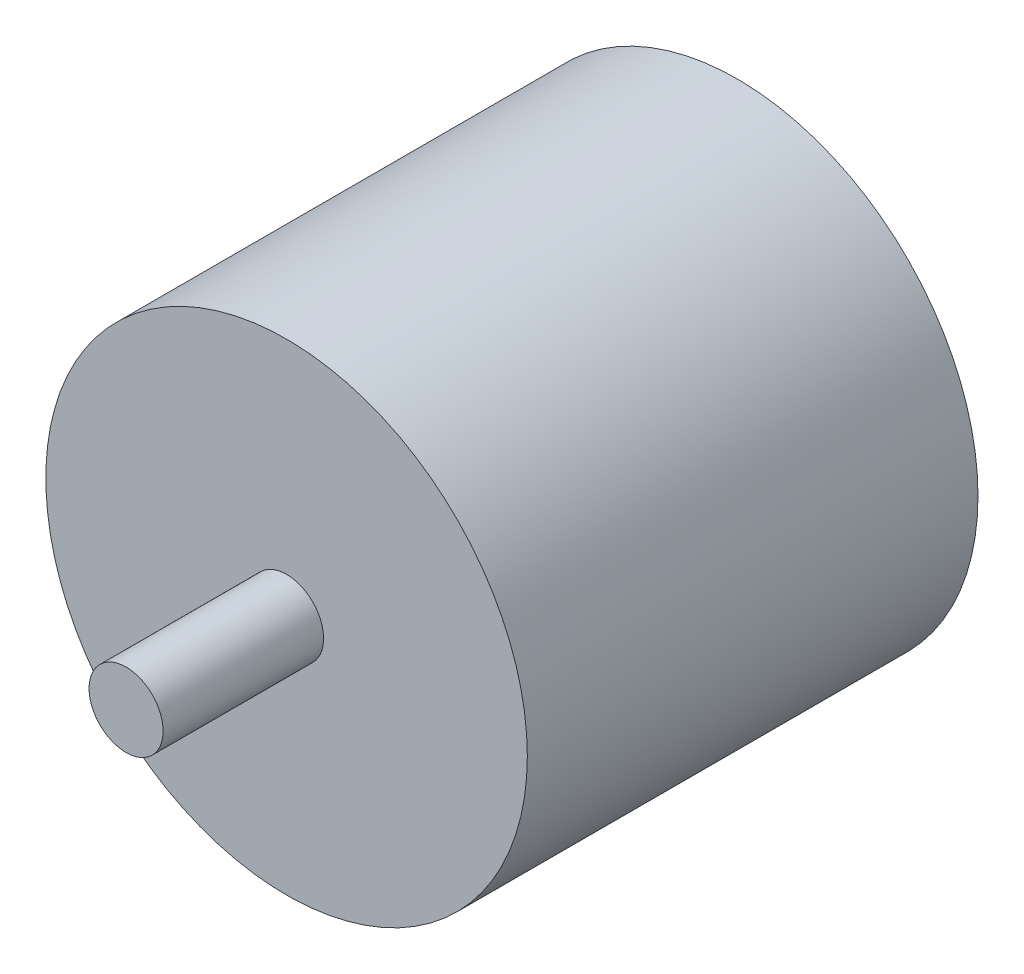
ISO-10303-21;
HEADER;
FILE_DESCRIPTION(('STEP AP214'),'2;1');
FILE_NAME('part.step','',(''),(''),'','','');
FILE_SCHEMA(('AUTOMOTIVE_DESIGN { 1 0 10303 214 1 1 1 1 }'));
ENDSEC;
DATA;
#1=APPLICATION_CONTEXT('core data for automotive mechanical design processes');
#2=APPLICATION_PROTOCOL_DEFINITION('international standard','automotive_design',2000,#1);
#3=PRODUCT_CONTEXT('',#1,'mechanical');
#4=PRODUCT('Part','Part','',(#3));
#5=PRODUCT_RELATED_PRODUCT_CATEGORY('part','',(#4));
#6=PRODUCT_DEFINITION_FORMATION('','',#4);
#7=PRODUCT_DEFINITION_CONTEXT('part definition',#1,'design');
#8=PRODUCT_DEFINITION('design','',#6,#7);
#9=PRODUCT_DEFINITION_SHAPE('','',#8);
#10=(LENGTH_UNIT() NAMED_UNIT(*) SI_UNIT(.MILLI.,.METRE.));
#11=(NAMED_UNIT(*) PLANE_ANGLE_UNIT() SI_UNIT($,.RADIAN.));
#12=(NAMED_UNIT(*) SI_UNIT($,.STERADIAN.) SOLID_ANGLE_UNIT());
#13=UNCERTAINTY_MEASURE_WITH_UNIT(LENGTH_MEASURE(1.E-05),#10,'distance_accuracy_value','');
#14=(GEOMETRIC_REPRESENTATION_CONTEXT(3) GLOBAL_UNCERTAINTY_ASSIGNED_CONTEXT((#13)) GLOBAL_UNIT_ASSIGNED_CONTEXT((#10,
#11,#12)) REPRESENTATION_CONTEXT('',''));
#15=CARTESIAN_POINT('',(0.,0.,0.));
#16=DIRECTION('',(0.,0.,1.));
#17=DIRECTION('',(1.,0.,0.));
#18=AXIS2_PLACEMENT_3D('',#15,#16,#17);
#19=CARTESIAN_POINT('',(0.,0.,-36.5));
#20=DIRECTION('',(0.,0.,1.));
#21=DIRECTION('',(1.,0.,0.));
#22=AXIS2_PLACEMENT_3D('',#19,#20,#21);
#23=CYLINDRICAL_SURFACE('',#22,19.5);
#24=CARTESIAN_POINT('',(0.,0.,-36.5));
#25=DIRECTION('',(0.,0.,1.));
#26=DIRECTION('',(1.,0.,0.));
#27=AXIS2_PLACEMENT_3D('',#24,#25,#26);
#28=CIRCLE('',#27,19.5);
#29=CARTESIAN_POINT('',(19.5,0.,-36.5));
#30=VERTEX_POINT('',#29);
#31=EDGE_CURVE('E10',#30,#30,#28,.T.);
#32=ORIENTED_EDGE('',*,*,#31,.T.);
#33=EDGE_LOOP('',(#32));
#34=FACE_BOUND('',#33,.T.);
#35=CARTESIAN_POINT('',(0.,0.,0.));
#36=DIRECTION('',(0.,0.,1.));
#37=DIRECTION('',(1.,0.,0.));
#38=AXIS2_PLACEMENT_3D('',#35,#36,#37);
#39=CIRCLE('',#38,19.5);
#40=CARTESIAN_POINT('',(19.5,0.,0.));
#41=VERTEX_POINT('',#40);
#42=EDGE_CURVE('E36',#41,#41,#39,.T.);
#43=ORIENTED_EDGE('',*,*,#42,.F.);
#44=EDGE_LOOP('',(#43));
#45=FACE_BOUND('',#44,.T.);
#46=ADVANCED_FACE('F33',(#34,#45),#23,.T.);
#47=CARTESIAN_POINT('',(0.,0.,-36.5));
#48=DIRECTION('',(0.,0.,1.));
#49=DIRECTION('',(1.,0.,0.));
#50=AXIS2_PLACEMENT_3D('',#47,#48,#49);
#51=PLANE('',#50);
#52=ORIENTED_EDGE('',*,*,#31,.F.);
#53=EDGE_LOOP('',(#52));
#54=FACE_BOUND('',#53,.T.);
#55=ADVANCED_FACE('F62',(#54),#51,.F.);
#56=CARTESIAN_POINT('',(0.,0.,0.));
#57=DIRECTION('',(0.,0.,1.));
#58=DIRECTION('',(1.,0.,0.));
#59=AXIS2_PLACEMENT_3D('',#56,#57,#58);
#60=PLANE('',#59);
#61=CARTESIAN_POINT('',(0.,0.,0.));
#62=DIRECTION('',(0.,0.,1.));
#63=DIRECTION('',(1.,0.,0.));
#64=AXIS2_PLACEMENT_3D('',#61,#62,#63);
#65=CIRCLE('',#64,3.);
#66=CARTESIAN_POINT('',(-3.,0.,0.));
#67=VERTEX_POINT('',#66);
#68=EDGE_CURVE('E45',#67,#67,#65,.T.);
#69=ORIENTED_EDGE('',*,*,#68,.F.);
#70=EDGE_LOOP('',(#69));
#71=FACE_BOUND('',#70,.T.);
#72=ORIENTED_EDGE('',*,*,#42,.T.);
#73=EDGE_LOOP('',(#72));
#74=FACE_BOUND('',#73,.T.);
#75=ADVANCED_FACE('F56',(#71,#74),#60,.T.);
#76=CARTESIAN_POINT('',(0.,0.,13.));
#77=DIRECTION('',(0.,0.,-1.));
#78=DIRECTION('',(-1.,0.,0.));
#79=AXIS2_PLACEMENT_3D('',#76,#77,#78);
#80=CYLINDRICAL_SURFACE('',#79,3.);
#81=CARTESIAN_POINT('',(0.,0.,13.));
#82=DIRECTION('',(0.,0.,1.));
#83=DIRECTION('',(1.,0.,0.));
#84=AXIS2_PLACEMENT_3D('',#81,#82,#83);
#85=CIRCLE('',#84,3.);
#86=CARTESIAN_POINT('',(-3.,0.,13.));
#87=VERTEX_POINT('',#86);
#88=EDGE_CURVE('E43',#87,#87,#85,.T.);
#89=CARTESIAN_POINT('',(-3.,0.,13.));
#90=CARTESIAN_POINT('',(-3.,0.,12.8645833333333));
#91=CARTESIAN_POINT('',(-3.,0.,12.7291666666667));
#92=CARTESIAN_POINT('',(-3.,0.,12.4583333333333));
#93=CARTESIAN_POINT('',(-3.,0.,12.3229166666667));
#94=CARTESIAN_POINT('',(-3.,0.,12.0520833333333));
#95=CARTESIAN_POINT('',(-3.,0.,11.9166666666667));
#96=CARTESIAN_POINT('',(-3.,0.,11.6458333333333));
#97=CARTESIAN_POINT('',(-3.,0.,11.5104166666667));
#98=CARTESIAN_POINT('',(-3.,0.,11.2395833333333));
#99=CARTESIAN_POINT('',(-3.,0.,11.1041666666667));
#100=CARTESIAN_POINT('',(-3.,0.,10.8333333333333));
#101=CARTESIAN_POINT('',(-3.,0.,10.6979166666667));
#102=CARTESIAN_POINT('',(-3.,0.,10.4270833333333));
#103=CARTESIAN_POINT('',(-3.,0.,10.2916666666667));
#104=CARTESIAN_POINT('',(-3.,0.,10.0208333333333));
#105=CARTESIAN_POINT('',(-3.,0.,9.88541666666667));
#106=CARTESIAN_POINT('',(-3.,0.,9.61458333333333));
#107=CARTESIAN_POINT('',(-3.,0.,9.47916666666667));
#108=CARTESIAN_POINT('',(-3.,0.,9.20833333333333));
#109=CARTESIAN_POINT('',(-3.,0.,9.07291666666667));
#110=CARTESIAN_POINT('',(-3.,0.,8.80208333333333));
#111=CARTESIAN_POINT('',(-3.,0.,8.66666666666667));
#112=CARTESIAN_POINT('',(-3.,0.,8.39583333333333));
#113=CARTESIAN_POINT('',(-3.,0.,8.26041666666667));
#114=CARTESIAN_POINT('',(-3.,0.,7.98958333333333));
#115=CARTESIAN_POINT('',(-3.,0.,7.85416666666667));
#116=CARTESIAN_POINT('',(-3.,0.,7.58333333333333));
#117=CARTESIAN_POINT('',(-3.,0.,7.44791666666667));
#118=CARTESIAN_POINT('',(-3.,0.,7.17708333333333));
#119=CARTESIAN_POINT('',(-3.,0.,7.04166666666667));
#120=CARTESIAN_POINT('',(-3.,0.,6.77083333333333));
#121=CARTESIAN_POINT('',(-3.,0.,6.63541666666667));
#122=CARTESIAN_POINT('',(-3.,0.,6.36458333333333));
#123=CARTESIAN_POINT('',(-3.,0.,6.22916666666667));
#124=CARTESIAN_POINT('',(-3.,0.,5.95833333333333));
#125=CARTESIAN_POINT('',(-3.,0.,5.82291666666667));
#126=CARTESIAN_POINT('',(-3.,0.,5.55208333333333));
#127=CARTESIAN_POINT('',(-3.,0.,5.41666666666667));
#128=CARTESIAN_POINT('',(-3.,0.,5.14583333333333));
#129=CARTESIAN_POINT('',(-3.,0.,5.01041666666667));
#130=CARTESIAN_POINT('',(-3.,0.,4.73958333333333));
#131=CARTESIAN_POINT('',(-3.,0.,4.60416666666667));
#132=CARTESIAN_POINT('',(-3.,0.,4.33333333333333));
#133=CARTESIAN_POINT('',(-3.,0.,4.19791666666667));
#134=CARTESIAN_POINT('',(-3.,0.,3.92708333333333));
#135=CARTESIAN_POINT('',(-3.,0.,3.79166666666667));
#136=CARTESIAN_POINT('',(-3.,0.,3.52083333333333));
#137=CARTESIAN_POINT('',(-3.,0.,3.38541666666667));
#138=CARTESIAN_POINT('',(-3.,0.,3.11458333333333));
#139=CARTESIAN_POINT('',(-3.,0.,2.97916666666667));
#140=CARTESIAN_POINT('',(-3.,0.,2.70833333333333));
#141=CARTESIAN_POINT('',(-3.,0.,2.57291666666667));
#142=CARTESIAN_POINT('',(-3.,0.,2.30208333333333));
#143=CARTESIAN_POINT('',(-3.,0.,2.16666666666667));
#144=CARTESIAN_POINT('',(-3.,0.,1.89583333333333));
#145=CARTESIAN_POINT('',(-3.,0.,1.76041666666667));
#146=CARTESIAN_POINT('',(-3.,0.,1.48958333333333));
#147=CARTESIAN_POINT('',(-3.,0.,1.35416666666667));
#148=CARTESIAN_POINT('',(-3.,0.,1.08333333333333));
#149=CARTESIAN_POINT('',(-3.,0.,0.947916666666667));
#150=CARTESIAN_POINT('',(-3.,0.,0.677083333333334));
#151=CARTESIAN_POINT('',(-3.,0.,0.541666666666667));
#152=CARTESIAN_POINT('',(-3.,0.,0.270833333333334));
#153=CARTESIAN_POINT('',(-3.,0.,0.135416666666667));
#154=CARTESIAN_POINT('',(-3.,0.,0.));
#155=B_SPLINE_CURVE_WITH_KNOTS('',3,(#89,#90,#91,#92,#93,#94,#95,#96,#97,#98,#99,#100,#101,#102,
#103,#104,#105,#106,#107,#108,#109,#110,#111,#112,#113,#114,#115,#116,#117,#118,#119,#120,#121,
#122,#123,#124,#125,#126,#127,#128,#129,#130,#131,#132,#133,#134,#135,#136,#137,#138,#139,#140,
#141,#142,#143,#144,#145,#146,#147,#148,#149,#150,#151,#152,#153,#154),.UNSPECIFIED.,.F.,.F.,(4,
2,2,2,2,2,2,2,2,2,2,2,2,2,2,2,2,2,2,2,2,2,2,2,2,2,2,2,2,2,2,2,4),(0.,0.406249999999999,
0.812499999999999,1.21875,1.625,2.03125,2.4375,2.84375,3.25,3.65625,4.0625,4.46875,4.875,
5.28125,5.6875,6.09375,6.5,6.90625,7.3125,7.71875,8.125,8.53125,8.9375,9.34375,9.75,10.15625,
10.5625,10.96875,11.375,11.78125,12.1875,12.59375,13.),.UNSPECIFIED.);
#156=EDGE_CURVE('BSEAM53',#87,#67,#155,.T.);
#157=ORIENTED_EDGE('',*,*,#88,.F.);
#158=ORIENTED_EDGE('',*,*,#68,.T.);
#159=ORIENTED_EDGE('',*,*,#156,.T.);
#160=ORIENTED_EDGE('',*,*,#156,.F.);
#161=EDGE_LOOP('',(#157,#159,#158,#160));
#162=FACE_BOUND('',#161,.T.);
#163=ADVANCED_FACE('F53',(#162),#80,.T.);
#164=CARTESIAN_POINT('',(0.,0.,13.));
#165=DIRECTION('',(0.,0.,1.));
#166=DIRECTION('',(1.,0.,0.));
#167=AXIS2_PLACEMENT_3D('',#164,#165,#166);
#168=PLANE('',#167);
#169=ORIENTED_EDGE('',*,*,#88,.T.);
#170=EDGE_LOOP('',(#169));
#171=FACE_BOUND('',#170,.T.);
#172=ADVANCED_FACE('F51',(#171),#168,.T.);
#173=CLOSED_SHELL('',(#46,#55,#75,#163,#172));
#174=MANIFOLD_SOLID_BREP('B2',#173);
#175=ADVANCED_BREP_SHAPE_REPRESENTATION('',(#18,#174),#14);
#176=SHAPE_DEFINITION_REPRESENTATION(#9,#175);
ENDSEC;
END-ISO-10303-21;
